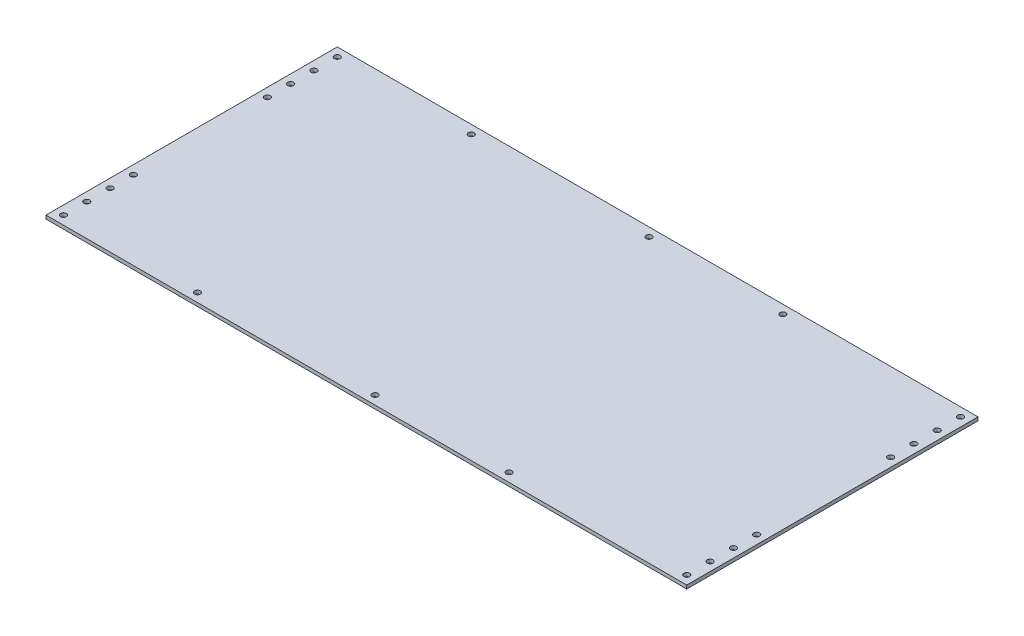
ISO-10303-21;
HEADER;
FILE_DESCRIPTION(('STEP AP214'),'2;1');
FILE_NAME('part.step','',(''),(''),'','','');
FILE_SCHEMA(('AUTOMOTIVE_DESIGN { 1 0 10303 214 1 1 1 1 }'));
ENDSEC;
DATA;
#1=APPLICATION_CONTEXT('core data for automotive mechanical design processes');
#2=APPLICATION_PROTOCOL_DEFINITION('international standard','automotive_design',2000,#1);
#3=PRODUCT_CONTEXT('',#1,'mechanical');
#4=PRODUCT('Part','Part','',(#3));
#5=PRODUCT_RELATED_PRODUCT_CATEGORY('part','',(#4));
#6=PRODUCT_DEFINITION_FORMATION('','',#4);
#7=PRODUCT_DEFINITION_CONTEXT('part definition',#1,'design');
#8=PRODUCT_DEFINITION('design','',#6,#7);
#9=PRODUCT_DEFINITION_SHAPE('','',#8);
#10=(LENGTH_UNIT() NAMED_UNIT(*) SI_UNIT(.MILLI.,.METRE.));
#11=(NAMED_UNIT(*) PLANE_ANGLE_UNIT() SI_UNIT($,.RADIAN.));
#12=(NAMED_UNIT(*) SI_UNIT($,.STERADIAN.) SOLID_ANGLE_UNIT());
#13=UNCERTAINTY_MEASURE_WITH_UNIT(LENGTH_MEASURE(1.E-05),#10,'distance_accuracy_value','');
#14=(GEOMETRIC_REPRESENTATION_CONTEXT(3) GLOBAL_UNCERTAINTY_ASSIGNED_CONTEXT((#13)) GLOBAL_UNIT_ASSIGNED_CONTEXT((#10,
#11,#12)) REPRESENTATION_CONTEXT('',''));
#15=CARTESIAN_POINT('',(0.,0.,0.));
#16=DIRECTION('',(0.,0.,1.));
#17=DIRECTION('',(1.,0.,0.));
#18=AXIS2_PLACEMENT_3D('',#15,#16,#17);
#19=CARTESIAN_POINT('',(-1100.,-12.,499.999999999999));
#20=DIRECTION('',(-1.,0.,0.));
#21=DIRECTION('',(0.,0.,1.));
#22=AXIS2_PLACEMENT_3D('',#19,#20,#21);
#23=PLANE('',#22);
#24=DIRECTION('',(0.,0.,1.));
#25=VECTOR('',#24,1.);
#26=CARTESIAN_POINT('',(-1100.,0.,499.999999999999));
#27=LINE('',#26,#25);
#28=CARTESIAN_POINT('',(-1100.,0.,-499.999999999999));
#29=VERTEX_POINT('',#28);
#30=CARTESIAN_POINT('',(-1100.,0.,499.999999999999));
#31=VERTEX_POINT('',#30);
#32=EDGE_CURVE('E97',#29,#31,#27,.T.);
#33=ORIENTED_EDGE('',*,*,#32,.F.);
#34=DIRECTION('',(0.,1.,0.));
#35=VECTOR('',#34,1.);
#36=CARTESIAN_POINT('',(-1100.,-12.,-499.999999999999));
#37=LINE('',#36,#35);
#38=CARTESIAN_POINT('',(-1100.,-12.,-499.999999999999));
#39=VERTEX_POINT('',#38);
#40=EDGE_CURVE('E11',#39,#29,#37,.T.);
#41=ORIENTED_EDGE('',*,*,#40,.F.);
#42=DIRECTION('',(0.,0.,1.));
#43=VECTOR('',#42,1.);
#44=CARTESIAN_POINT('',(-1100.,-12.,499.999999999999));
#45=LINE('',#44,#43);
#46=CARTESIAN_POINT('',(-1100.,-12.,499.999999999999));
#47=VERTEX_POINT('',#46);
#48=EDGE_CURVE('E90',#39,#47,#45,.T.);
#49=ORIENTED_EDGE('',*,*,#48,.T.);
#50=DIRECTION('',(0.,1.,0.));
#51=VECTOR('',#50,1.);
#52=CARTESIAN_POINT('',(-1100.,-12.,499.999999999999));
#53=LINE('',#52,#51);
#54=EDGE_CURVE('E35',#47,#31,#53,.T.);
#55=ORIENTED_EDGE('',*,*,#54,.T.);
#56=EDGE_LOOP('',(#33,#41,#49,#55));
#57=FACE_BOUND('',#56,.T.);
#58=ADVANCED_FACE('F32',(#57),#23,.T.);
#59=CARTESIAN_POINT('',(-1100.,-12.,-499.999999999999));
#60=DIRECTION('',(0.,0.,-1.));
#61=DIRECTION('',(-1.,0.,0.));
#62=AXIS2_PLACEMENT_3D('',#59,#60,#61);
#63=PLANE('',#62);
#64=DIRECTION('',(-1.,0.,0.));
#65=VECTOR('',#64,1.);
#66=CARTESIAN_POINT('',(-1100.,0.,-499.999999999999));
#67=LINE('',#66,#65);
#68=CARTESIAN_POINT('',(1100.,0.,-499.999999999999));
#69=VERTEX_POINT('',#68);
#70=EDGE_CURVE('E92',#69,#29,#67,.T.);
#71=ORIENTED_EDGE('',*,*,#70,.F.);
#72=DIRECTION('',(0.,1.,0.));
#73=VECTOR('',#72,1.);
#74=CARTESIAN_POINT('',(1100.,-12.,-499.999999999999));
#75=LINE('',#74,#73);
#76=CARTESIAN_POINT('',(1100.,-12.,-499.999999999999));
#77=VERTEX_POINT('',#76);
#78=EDGE_CURVE('E41',#77,#69,#75,.T.);
#79=ORIENTED_EDGE('',*,*,#78,.F.);
#80=DIRECTION('',(-1.,0.,0.));
#81=VECTOR('',#80,1.);
#82=CARTESIAN_POINT('',(-1100.,-12.,-499.999999999999));
#83=LINE('',#82,#81);
#84=EDGE_CURVE('E87',#77,#39,#83,.T.);
#85=ORIENTED_EDGE('',*,*,#84,.T.);
#86=ORIENTED_EDGE('',*,*,#40,.T.);
#87=EDGE_LOOP('',(#71,#79,#85,#86));
#88=FACE_BOUND('',#87,.T.);
#89=ADVANCED_FACE('F108',(#88),#63,.T.);
#90=CARTESIAN_POINT('',(1100.,-12.,500.000000000001));
#91=DIRECTION('',(1.,0.,0.));
#92=DIRECTION('',(0.,0.,-1.));
#93=AXIS2_PLACEMENT_3D('',#90,#91,#92);
#94=PLANE('',#93);
#95=DIRECTION('',(0.,0.,-1.));
#96=VECTOR('',#95,1.);
#97=CARTESIAN_POINT('',(1100.,0.,500.000000000001));
#98=LINE('',#97,#96);
#99=CARTESIAN_POINT('',(1100.,0.,500.000000000001));
#100=VERTEX_POINT('',#99);
#101=EDGE_CURVE('E82',#100,#69,#98,.T.);
#102=ORIENTED_EDGE('',*,*,#101,.F.);
#103=DIRECTION('',(0.,1.,0.));
#104=VECTOR('',#103,1.);
#105=CARTESIAN_POINT('',(1100.,-12.,500.000000000001));
#106=LINE('',#105,#104);
#107=CARTESIAN_POINT('',(1100.,-12.,500.000000000001));
#108=VERTEX_POINT('',#107);
#109=EDGE_CURVE('E77',#108,#100,#106,.T.);
#110=ORIENTED_EDGE('',*,*,#109,.F.);
#111=DIRECTION('',(0.,0.,-1.));
#112=VECTOR('',#111,1.);
#113=CARTESIAN_POINT('',(1100.,-12.,500.000000000001));
#114=LINE('',#113,#112);
#115=EDGE_CURVE('E80',#108,#77,#114,.T.);
#116=ORIENTED_EDGE('',*,*,#115,.T.);
#117=ORIENTED_EDGE('',*,*,#78,.T.);
#118=EDGE_LOOP('',(#102,#110,#116,#117));
#119=FACE_BOUND('',#118,.T.);
#120=ADVANCED_FACE('F79',(#119),#94,.T.);
#121=CARTESIAN_POINT('',(-1100.,-12.,499.999999999999));
#122=DIRECTION('',(0.,0.,1.));
#123=DIRECTION('',(1.,0.,0.));
#124=AXIS2_PLACEMENT_3D('',#121,#122,#123);
#125=PLANE('',#124);
#126=DIRECTION('',(1.,0.,0.));
#127=VECTOR('',#126,1.);
#128=CARTESIAN_POINT('',(-1100.,0.,499.999999999999));
#129=LINE('',#128,#127);
#130=EDGE_CURVE('E100',#31,#100,#129,.T.);
#131=ORIENTED_EDGE('',*,*,#130,.F.);
#132=ORIENTED_EDGE('',*,*,#54,.F.);
#133=DIRECTION('',(1.,0.,0.));
#134=VECTOR('',#133,1.);
#135=CARTESIAN_POINT('',(-1100.,-12.,499.999999999999));
#136=LINE('',#135,#134);
#137=EDGE_CURVE('E86',#47,#108,#136,.T.);
#138=ORIENTED_EDGE('',*,*,#137,.T.);
#139=ORIENTED_EDGE('',*,*,#109,.T.);
#140=EDGE_LOOP('',(#131,#132,#138,#139));
#141=FACE_BOUND('',#140,.T.);
#142=ADVANCED_FACE('F89',(#141),#125,.T.);
#143=CARTESIAN_POINT('',(0.,-12.,0.));
#144=DIRECTION('',(0.,-1.,0.));
#145=DIRECTION('',(0.,0.,-1.));
#146=AXIS2_PLACEMENT_3D('',#143,#144,#145);
#147=PLANE('',#146);
#148=CARTESIAN_POINT('',(-1070.,-12.,230.000000000003));
#149=DIRECTION('',(0.,1.,0.));
#150=DIRECTION('',(0.,0.,-1.));
#151=AXIS2_PLACEMENT_3D('',#148,#149,#150);
#152=CIRCLE('',#151,10.0000000000001);
#153=CARTESIAN_POINT('',(-1070.,-12.,220.000000000003));
#154=VERTEX_POINT('',#153);
#155=EDGE_CURVE('E221',#154,#154,#152,.T.);
#156=ORIENTED_EDGE('',*,*,#155,.T.);
#157=EDGE_LOOP('',(#156));
#158=FACE_BOUND('',#157,.T.);
#159=CARTESIAN_POINT('',(-1070.,-12.,310.000000000002));
#160=DIRECTION('',(0.,1.,0.));
#161=DIRECTION('',(0.,0.,-1.));
#162=AXIS2_PLACEMENT_3D('',#159,#160,#161);
#163=CIRCLE('',#162,9.99999999999988);
#164=CARTESIAN_POINT('',(-1070.,-12.,300.000000000002));
#165=VERTEX_POINT('',#164);
#166=EDGE_CURVE('E229',#165,#165,#163,.T.);
#167=ORIENTED_EDGE('',*,*,#166,.T.);
#168=EDGE_LOOP('',(#167));
#169=FACE_BOUND('',#168,.T.);
#170=CARTESIAN_POINT('',(-1070.,-12.,390.000000000001));
#171=DIRECTION('',(0.,1.,0.));
#172=DIRECTION('',(0.,0.,-1.));
#173=AXIS2_PLACEMENT_3D('',#170,#171,#172);
#174=CIRCLE('',#173,9.99999999999797);
#175=CARTESIAN_POINT('',(-1070.,-12.,380.000000000003));
#176=VERTEX_POINT('',#175);
#177=EDGE_CURVE('E235',#176,#176,#174,.T.);
#178=ORIENTED_EDGE('',*,*,#177,.T.);
#179=EDGE_LOOP('',(#178));
#180=FACE_BOUND('',#179,.T.);
#181=CARTESIAN_POINT('',(-1070.,-12.,470.));
#182=DIRECTION('',(0.,1.,0.));
#183=DIRECTION('',(0.,0.,-1.));
#184=AXIS2_PLACEMENT_3D('',#181,#182,#183);
#185=CIRCLE('',#184,10.0000000000001);
#186=CARTESIAN_POINT('',(-1070.,-12.,460.));
#187=VERTEX_POINT('',#186);
#188=EDGE_CURVE('E241',#187,#187,#185,.T.);
#189=ORIENTED_EDGE('',*,*,#188,.T.);
#190=EDGE_LOOP('',(#189));
#191=FACE_BOUND('',#190,.T.);
#192=CARTESIAN_POINT('',(-609.999999999998,-12.,469.999999999999));
#193=DIRECTION('',(0.,1.,0.));
#194=DIRECTION('',(0.,0.,-1.));
#195=AXIS2_PLACEMENT_3D('',#192,#193,#194);
#196=CIRCLE('',#195,9.99999999999998);
#197=CARTESIAN_POINT('',(-609.999999999998,-12.,459.999999999999));
#198=VERTEX_POINT('',#197);
#199=EDGE_CURVE('E247',#198,#198,#196,.T.);
#200=ORIENTED_EDGE('',*,*,#199,.T.);
#201=EDGE_LOOP('',(#200));
#202=FACE_BOUND('',#201,.T.);
#203=CARTESIAN_POINT('',(1.99840144432528E-12,-12.,469.999999999999));
#204=DIRECTION('',(0.,1.,0.));
#205=DIRECTION('',(0.,0.,-1.));
#206=AXIS2_PLACEMENT_3D('',#203,#204,#205);
#207=CIRCLE('',#206,9.99999999999998);
#208=CARTESIAN_POINT('',(1.99840144432528E-12,-12.,459.999999999999));
#209=VERTEX_POINT('',#208);
#210=EDGE_CURVE('E253',#209,#209,#207,.T.);
#211=ORIENTED_EDGE('',*,*,#210,.T.);
#212=EDGE_LOOP('',(#211));
#213=FACE_BOUND('',#212,.T.);
#214=CARTESIAN_POINT('',(460.000000000002,-12.,469.999999999999));
#215=DIRECTION('',(0.,1.,0.));
#216=DIRECTION('',(0.,0.,-1.));
#217=AXIS2_PLACEMENT_3D('',#214,#215,#216);
#218=CIRCLE('',#217,10.0000000000001);
#219=CARTESIAN_POINT('',(460.000000000002,-12.,459.999999999999));
#220=VERTEX_POINT('',#219);
#221=EDGE_CURVE('E259',#220,#220,#218,.T.);
#222=ORIENTED_EDGE('',*,*,#221,.T.);
#223=EDGE_LOOP('',(#222));
#224=FACE_BOUND('',#223,.T.);
#225=CARTESIAN_POINT('',(1070.,-12.,469.999999999999));
#226=DIRECTION('',(0.,1.,0.));
#227=DIRECTION('',(0.,0.,-1.));
#228=AXIS2_PLACEMENT_3D('',#225,#226,#227);
#229=CIRCLE('',#228,10.0000000000001);
#230=CARTESIAN_POINT('',(1070.,-12.,459.999999999999));
#231=VERTEX_POINT('',#230);
#232=EDGE_CURVE('E265',#231,#231,#229,.T.);
#233=ORIENTED_EDGE('',*,*,#232,.T.);
#234=EDGE_LOOP('',(#233));
#235=FACE_BOUND('',#234,.T.);
#236=CARTESIAN_POINT('',(1070.,-12.,390.));
#237=DIRECTION('',(0.,1.,0.));
#238=DIRECTION('',(0.,0.,-1.));
#239=AXIS2_PLACEMENT_3D('',#236,#237,#238);
#240=CIRCLE('',#239,9.99999999999818);
#241=CARTESIAN_POINT('',(1070.,-12.,380.000000000002));
#242=VERTEX_POINT('',#241);
#243=EDGE_CURVE('E271',#242,#242,#240,.T.);
#244=ORIENTED_EDGE('',*,*,#243,.T.);
#245=EDGE_LOOP('',(#244));
#246=FACE_BOUND('',#245,.T.);
#247=CARTESIAN_POINT('',(1070.,-12.,310.000000000001));
#248=DIRECTION('',(0.,1.,0.));
#249=DIRECTION('',(0.,0.,-1.));
#250=AXIS2_PLACEMENT_3D('',#247,#248,#249);
#251=CIRCLE('',#250,10.0000000000001);
#252=CARTESIAN_POINT('',(1070.,-12.,300.000000000001));
#253=VERTEX_POINT('',#252);
#254=EDGE_CURVE('E277',#253,#253,#251,.T.);
#255=ORIENTED_EDGE('',*,*,#254,.T.);
#256=EDGE_LOOP('',(#255));
#257=FACE_BOUND('',#256,.T.);
#258=CARTESIAN_POINT('',(1070.,-12.,230.000000000002));
#259=DIRECTION('',(0.,1.,0.));
#260=DIRECTION('',(0.,0.,-1.));
#261=AXIS2_PLACEMENT_3D('',#258,#259,#260);
#262=CIRCLE('',#261,10.0000000000001);
#263=CARTESIAN_POINT('',(1070.,-12.,220.000000000002));
#264=VERTEX_POINT('',#263);
#265=EDGE_CURVE('E283',#264,#264,#262,.T.);
#266=ORIENTED_EDGE('',*,*,#265,.T.);
#267=EDGE_LOOP('',(#266));
#268=FACE_BOUND('',#267,.T.);
#269=CARTESIAN_POINT('',(-1070.,-12.,-310.000000000001));
#270=DIRECTION('',(0.,1.,0.));
#271=DIRECTION('',(0.,0.,1.));
#272=AXIS2_PLACEMENT_3D('',#269,#270,#271);
#273=CIRCLE('',#272,9.99999999999988);
#274=CARTESIAN_POINT('',(-1070.,-12.,-300.000000000001));
#275=VERTEX_POINT('',#274);
#276=EDGE_CURVE('E289',#275,#275,#273,.T.);
#277=ORIENTED_EDGE('',*,*,#276,.T.);
#278=EDGE_LOOP('',(#277));
#279=FACE_BOUND('',#278,.T.);
#280=CARTESIAN_POINT('',(-1070.,-12.,-230.000000000002));
#281=DIRECTION('',(0.,1.,0.));
#282=DIRECTION('',(0.,0.,1.));
#283=AXIS2_PLACEMENT_3D('',#280,#281,#282);
#284=CIRCLE('',#283,10.0000000000001);
#285=CARTESIAN_POINT('',(-1070.,-12.,-220.000000000002));
#286=VERTEX_POINT('',#285);
#287=EDGE_CURVE('E295',#286,#286,#284,.T.);
#288=ORIENTED_EDGE('',*,*,#287,.T.);
#289=EDGE_LOOP('',(#288));
#290=FACE_BOUND('',#289,.T.);
#291=CARTESIAN_POINT('',(-1070.,-12.,-390.));
#292=DIRECTION('',(0.,1.,0.));
#293=DIRECTION('',(0.,0.,1.));
#294=AXIS2_PLACEMENT_3D('',#291,#292,#293);
#295=CIRCLE('',#294,9.99999999999797);
#296=CARTESIAN_POINT('',(-1070.,-12.,-380.000000000002));
#297=VERTEX_POINT('',#296);
#298=EDGE_CURVE('E301',#297,#297,#295,.T.);
#299=ORIENTED_EDGE('',*,*,#298,.T.);
#300=EDGE_LOOP('',(#299));
#301=FACE_BOUND('',#300,.T.);
#302=CARTESIAN_POINT('',(-609.999999999998,-12.,-469.999999999999));
#303=DIRECTION('',(0.,1.,0.));
#304=DIRECTION('',(0.,0.,1.));
#305=AXIS2_PLACEMENT_3D('',#302,#303,#304);
#306=CIRCLE('',#305,9.99999999999998);
#307=CARTESIAN_POINT('',(-609.999999999998,-12.,-459.999999999999));
#308=VERTEX_POINT('',#307);
#309=EDGE_CURVE('E307',#308,#308,#306,.T.);
#310=ORIENTED_EDGE('',*,*,#309,.T.);
#311=EDGE_LOOP('',(#310));
#312=FACE_BOUND('',#311,.T.);
#313=CARTESIAN_POINT('',(1.99840144432528E-12,-12.,-469.999999999999));
#314=DIRECTION('',(0.,1.,0.));
#315=DIRECTION('',(0.,0.,1.));
#316=AXIS2_PLACEMENT_3D('',#313,#314,#315);
#317=CIRCLE('',#316,9.99999999999998);
#318=CARTESIAN_POINT('',(1.99840144432528E-12,-12.,-459.999999999999));
#319=VERTEX_POINT('',#318);
#320=EDGE_CURVE('E313',#319,#319,#317,.T.);
#321=ORIENTED_EDGE('',*,*,#320,.T.);
#322=EDGE_LOOP('',(#321));
#323=FACE_BOUND('',#322,.T.);
#324=CARTESIAN_POINT('',(460.000000000002,-12.,-469.999999999999));
#325=DIRECTION('',(0.,1.,0.));
#326=DIRECTION('',(0.,0.,1.));
#327=AXIS2_PLACEMENT_3D('',#324,#325,#326);
#328=CIRCLE('',#327,10.0000000000001);
#329=CARTESIAN_POINT('',(460.000000000002,-12.,-459.999999999999));
#330=VERTEX_POINT('',#329);
#331=EDGE_CURVE('E319',#330,#330,#328,.T.);
#332=ORIENTED_EDGE('',*,*,#331,.T.);
#333=EDGE_LOOP('',(#332));
#334=FACE_BOUND('',#333,.T.);
#335=CARTESIAN_POINT('',(1070.,-12.,-390.));
#336=DIRECTION('',(0.,1.,0.));
#337=DIRECTION('',(0.,0.,1.));
#338=AXIS2_PLACEMENT_3D('',#335,#336,#337);
#339=CIRCLE('',#338,9.99999999999818);
#340=CARTESIAN_POINT('',(1070.,-12.,-380.000000000002));
#341=VERTEX_POINT('',#340);
#342=EDGE_CURVE('E325',#341,#341,#339,.T.);
#343=ORIENTED_EDGE('',*,*,#342,.T.);
#344=EDGE_LOOP('',(#343));
#345=FACE_BOUND('',#344,.T.);
#346=CARTESIAN_POINT('',(1070.,-12.,-310.000000000001));
#347=DIRECTION('',(0.,1.,0.));
#348=DIRECTION('',(0.,0.,1.));
#349=AXIS2_PLACEMENT_3D('',#346,#347,#348);
#350=CIRCLE('',#349,10.0000000000001);
#351=CARTESIAN_POINT('',(1070.,-12.,-300.000000000001));
#352=VERTEX_POINT('',#351);
#353=EDGE_CURVE('E331',#352,#352,#350,.T.);
#354=ORIENTED_EDGE('',*,*,#353,.T.);
#355=EDGE_LOOP('',(#354));
#356=FACE_BOUND('',#355,.T.);
#357=CARTESIAN_POINT('',(1070.,-12.,-230.000000000002));
#358=DIRECTION('',(0.,1.,0.));
#359=DIRECTION('',(0.,0.,1.));
#360=AXIS2_PLACEMENT_3D('',#357,#358,#359);
#361=CIRCLE('',#360,10.0000000000001);
#362=CARTESIAN_POINT('',(1070.,-12.,-220.000000000002));
#363=VERTEX_POINT('',#362);
#364=EDGE_CURVE('E337',#363,#363,#361,.T.);
#365=ORIENTED_EDGE('',*,*,#364,.T.);
#366=EDGE_LOOP('',(#365));
#367=FACE_BOUND('',#366,.T.);
#368=CARTESIAN_POINT('',(1070.,-12.,-469.999999999999));
#369=DIRECTION('',(0.,1.,0.));
#370=DIRECTION('',(0.,0.,1.));
#371=AXIS2_PLACEMENT_3D('',#368,#369,#370);
#372=CIRCLE('',#371,10.0000000000001);
#373=CARTESIAN_POINT('',(1070.,-12.,-459.999999999999));
#374=VERTEX_POINT('',#373);
#375=EDGE_CURVE('E343',#374,#374,#372,.T.);
#376=ORIENTED_EDGE('',*,*,#375,.T.);
#377=EDGE_LOOP('',(#376));
#378=FACE_BOUND('',#377,.T.);
#379=CARTESIAN_POINT('',(-1070.,-12.,-469.999999999999));
#380=DIRECTION('',(0.,1.,0.));
#381=DIRECTION('',(0.,0.,1.));
#382=AXIS2_PLACEMENT_3D('',#379,#380,#381);
#383=CIRCLE('',#382,9.99999999999988);
#384=CARTESIAN_POINT('',(-1070.,-12.,-459.999999999999));
#385=VERTEX_POINT('',#384);
#386=EDGE_CURVE('E101',#385,#385,#383,.T.);
#387=ORIENTED_EDGE('',*,*,#386,.T.);
#388=EDGE_LOOP('',(#387));
#389=FACE_BOUND('',#388,.T.);
#390=ORIENTED_EDGE('',*,*,#48,.F.);
#391=ORIENTED_EDGE('',*,*,#84,.F.);
#392=ORIENTED_EDGE('',*,*,#115,.F.);
#393=ORIENTED_EDGE('',*,*,#137,.F.);
#394=EDGE_LOOP('',(#390,#391,#392,#393));
#395=FACE_BOUND('',#394,.T.);
#396=ADVANCED_FACE('F85',(#158,#169,#180,#191,#202,#213,#224,#235,#246,#257,#268,#279,#290,#301,
#312,#323,#334,#345,#356,#367,#378,#389,#395),#147,.T.);
#397=CARTESIAN_POINT('',(0.,0.,0.));
#398=DIRECTION('',(0.,-1.,0.));
#399=DIRECTION('',(0.,0.,-1.));
#400=AXIS2_PLACEMENT_3D('',#397,#398,#399);
#401=PLANE('',#400);
#402=CARTESIAN_POINT('',(-1070.,0.,230.000000000003));
#403=DIRECTION('',(0.,1.,0.));
#404=DIRECTION('',(0.,0.,-1.));
#405=AXIS2_PLACEMENT_3D('',#402,#403,#404);
#406=CIRCLE('',#405,10.0000000000001);
#407=CARTESIAN_POINT('',(-1070.,0.,220.000000000003));
#408=VERTEX_POINT('',#407);
#409=EDGE_CURVE('E224',#408,#408,#406,.T.);
#410=ORIENTED_EDGE('',*,*,#409,.F.);
#411=EDGE_LOOP('',(#410));
#412=FACE_BOUND('',#411,.T.);
#413=CARTESIAN_POINT('',(-1070.,0.,310.000000000002));
#414=DIRECTION('',(0.,1.,0.));
#415=DIRECTION('',(0.,0.,-1.));
#416=AXIS2_PLACEMENT_3D('',#413,#414,#415);
#417=CIRCLE('',#416,9.99999999999988);
#418=CARTESIAN_POINT('',(-1070.,0.,300.000000000002));
#419=VERTEX_POINT('',#418);
#420=EDGE_CURVE('E226',#419,#419,#417,.T.);
#421=ORIENTED_EDGE('',*,*,#420,.F.);
#422=EDGE_LOOP('',(#421));
#423=FACE_BOUND('',#422,.T.);
#424=CARTESIAN_POINT('',(-1070.,0.,390.000000000001));
#425=DIRECTION('',(0.,1.,0.));
#426=DIRECTION('',(0.,0.,-1.));
#427=AXIS2_PLACEMENT_3D('',#424,#425,#426);
#428=CIRCLE('',#427,9.99999999999797);
#429=CARTESIAN_POINT('',(-1070.,0.,380.000000000003));
#430=VERTEX_POINT('',#429);
#431=EDGE_CURVE('E232',#430,#430,#428,.T.);
#432=ORIENTED_EDGE('',*,*,#431,.F.);
#433=EDGE_LOOP('',(#432));
#434=FACE_BOUND('',#433,.T.);
#435=CARTESIAN_POINT('',(-1070.,0.,470.));
#436=DIRECTION('',(0.,1.,0.));
#437=DIRECTION('',(0.,0.,-1.));
#438=AXIS2_PLACEMENT_3D('',#435,#436,#437);
#439=CIRCLE('',#438,10.0000000000001);
#440=CARTESIAN_POINT('',(-1070.,0.,460.));
#441=VERTEX_POINT('',#440);
#442=EDGE_CURVE('E238',#441,#441,#439,.T.);
#443=ORIENTED_EDGE('',*,*,#442,.F.);
#444=EDGE_LOOP('',(#443));
#445=FACE_BOUND('',#444,.T.);
#446=CARTESIAN_POINT('',(-609.999999999998,0.,469.999999999999));
#447=DIRECTION('',(0.,1.,0.));
#448=DIRECTION('',(0.,0.,-1.));
#449=AXIS2_PLACEMENT_3D('',#446,#447,#448);
#450=CIRCLE('',#449,9.99999999999998);
#451=CARTESIAN_POINT('',(-609.999999999998,0.,459.999999999999));
#452=VERTEX_POINT('',#451);
#453=EDGE_CURVE('E244',#452,#452,#450,.T.);
#454=ORIENTED_EDGE('',*,*,#453,.F.);
#455=EDGE_LOOP('',(#454));
#456=FACE_BOUND('',#455,.T.);
#457=CARTESIAN_POINT('',(1.99840144432528E-12,0.,469.999999999999));
#458=DIRECTION('',(0.,1.,0.));
#459=DIRECTION('',(0.,0.,-1.));
#460=AXIS2_PLACEMENT_3D('',#457,#458,#459);
#461=CIRCLE('',#460,9.99999999999998);
#462=CARTESIAN_POINT('',(1.99840144432528E-12,0.,459.999999999999));
#463=VERTEX_POINT('',#462);
#464=EDGE_CURVE('E250',#463,#463,#461,.T.);
#465=ORIENTED_EDGE('',*,*,#464,.F.);
#466=EDGE_LOOP('',(#465));
#467=FACE_BOUND('',#466,.T.);
#468=CARTESIAN_POINT('',(460.000000000002,0.,469.999999999999));
#469=DIRECTION('',(0.,1.,0.));
#470=DIRECTION('',(0.,0.,-1.));
#471=AXIS2_PLACEMENT_3D('',#468,#469,#470);
#472=CIRCLE('',#471,10.0000000000001);
#473=CARTESIAN_POINT('',(460.000000000002,0.,459.999999999999));
#474=VERTEX_POINT('',#473);
#475=EDGE_CURVE('E256',#474,#474,#472,.T.);
#476=ORIENTED_EDGE('',*,*,#475,.F.);
#477=EDGE_LOOP('',(#476));
#478=FACE_BOUND('',#477,.T.);
#479=CARTESIAN_POINT('',(1070.,0.,469.999999999999));
#480=DIRECTION('',(0.,1.,0.));
#481=DIRECTION('',(0.,0.,-1.));
#482=AXIS2_PLACEMENT_3D('',#479,#480,#481);
#483=CIRCLE('',#482,10.0000000000001);
#484=CARTESIAN_POINT('',(1070.,0.,459.999999999999));
#485=VERTEX_POINT('',#484);
#486=EDGE_CURVE('E262',#485,#485,#483,.T.);
#487=ORIENTED_EDGE('',*,*,#486,.F.);
#488=EDGE_LOOP('',(#487));
#489=FACE_BOUND('',#488,.T.);
#490=CARTESIAN_POINT('',(1070.,0.,390.));
#491=DIRECTION('',(0.,1.,0.));
#492=DIRECTION('',(0.,0.,-1.));
#493=AXIS2_PLACEMENT_3D('',#490,#491,#492);
#494=CIRCLE('',#493,9.99999999999818);
#495=CARTESIAN_POINT('',(1070.,0.,380.000000000002));
#496=VERTEX_POINT('',#495);
#497=EDGE_CURVE('E268',#496,#496,#494,.T.);
#498=ORIENTED_EDGE('',*,*,#497,.F.);
#499=EDGE_LOOP('',(#498));
#500=FACE_BOUND('',#499,.T.);
#501=CARTESIAN_POINT('',(1070.,0.,310.000000000001));
#502=DIRECTION('',(0.,1.,0.));
#503=DIRECTION('',(0.,0.,-1.));
#504=AXIS2_PLACEMENT_3D('',#501,#502,#503);
#505=CIRCLE('',#504,10.0000000000001);
#506=CARTESIAN_POINT('',(1070.,0.,300.000000000001));
#507=VERTEX_POINT('',#506);
#508=EDGE_CURVE('E274',#507,#507,#505,.T.);
#509=ORIENTED_EDGE('',*,*,#508,.F.);
#510=EDGE_LOOP('',(#509));
#511=FACE_BOUND('',#510,.T.);
#512=CARTESIAN_POINT('',(1070.,0.,230.000000000002));
#513=DIRECTION('',(0.,1.,0.));
#514=DIRECTION('',(0.,0.,-1.));
#515=AXIS2_PLACEMENT_3D('',#512,#513,#514);
#516=CIRCLE('',#515,10.0000000000001);
#517=CARTESIAN_POINT('',(1070.,0.,220.000000000002));
#518=VERTEX_POINT('',#517);
#519=EDGE_CURVE('E280',#518,#518,#516,.T.);
#520=ORIENTED_EDGE('',*,*,#519,.F.);
#521=EDGE_LOOP('',(#520));
#522=FACE_BOUND('',#521,.T.);
#523=CARTESIAN_POINT('',(-1070.,0.,-310.000000000001));
#524=DIRECTION('',(0.,1.,0.));
#525=DIRECTION('',(0.,0.,1.));
#526=AXIS2_PLACEMENT_3D('',#523,#524,#525);
#527=CIRCLE('',#526,9.99999999999988);
#528=CARTESIAN_POINT('',(-1070.,0.,-300.000000000001));
#529=VERTEX_POINT('',#528);
#530=EDGE_CURVE('E286',#529,#529,#527,.T.);
#531=ORIENTED_EDGE('',*,*,#530,.F.);
#532=EDGE_LOOP('',(#531));
#533=FACE_BOUND('',#532,.T.);
#534=CARTESIAN_POINT('',(-1070.,0.,-230.000000000002));
#535=DIRECTION('',(0.,1.,0.));
#536=DIRECTION('',(0.,0.,1.));
#537=AXIS2_PLACEMENT_3D('',#534,#535,#536);
#538=CIRCLE('',#537,10.0000000000001);
#539=CARTESIAN_POINT('',(-1070.,0.,-220.000000000002));
#540=VERTEX_POINT('',#539);
#541=EDGE_CURVE('E292',#540,#540,#538,.T.);
#542=ORIENTED_EDGE('',*,*,#541,.F.);
#543=EDGE_LOOP('',(#542));
#544=FACE_BOUND('',#543,.T.);
#545=CARTESIAN_POINT('',(-1070.,0.,-390.));
#546=DIRECTION('',(0.,1.,0.));
#547=DIRECTION('',(0.,0.,1.));
#548=AXIS2_PLACEMENT_3D('',#545,#546,#547);
#549=CIRCLE('',#548,9.99999999999797);
#550=CARTESIAN_POINT('',(-1070.,0.,-380.000000000002));
#551=VERTEX_POINT('',#550);
#552=EDGE_CURVE('E298',#551,#551,#549,.T.);
#553=ORIENTED_EDGE('',*,*,#552,.F.);
#554=EDGE_LOOP('',(#553));
#555=FACE_BOUND('',#554,.T.);
#556=CARTESIAN_POINT('',(-609.999999999998,0.,-469.999999999999));
#557=DIRECTION('',(0.,1.,0.));
#558=DIRECTION('',(0.,0.,1.));
#559=AXIS2_PLACEMENT_3D('',#556,#557,#558);
#560=CIRCLE('',#559,9.99999999999998);
#561=CARTESIAN_POINT('',(-609.999999999998,0.,-459.999999999999));
#562=VERTEX_POINT('',#561);
#563=EDGE_CURVE('E304',#562,#562,#560,.T.);
#564=ORIENTED_EDGE('',*,*,#563,.F.);
#565=EDGE_LOOP('',(#564));
#566=FACE_BOUND('',#565,.T.);
#567=CARTESIAN_POINT('',(1.99840144432528E-12,0.,-469.999999999999));
#568=DIRECTION('',(0.,1.,0.));
#569=DIRECTION('',(0.,0.,1.));
#570=AXIS2_PLACEMENT_3D('',#567,#568,#569);
#571=CIRCLE('',#570,9.99999999999998);
#572=CARTESIAN_POINT('',(1.99840144432528E-12,0.,-459.999999999999));
#573=VERTEX_POINT('',#572);
#574=EDGE_CURVE('E310',#573,#573,#571,.T.);
#575=ORIENTED_EDGE('',*,*,#574,.F.);
#576=EDGE_LOOP('',(#575));
#577=FACE_BOUND('',#576,.T.);
#578=CARTESIAN_POINT('',(460.000000000002,0.,-469.999999999999));
#579=DIRECTION('',(0.,1.,0.));
#580=DIRECTION('',(0.,0.,1.));
#581=AXIS2_PLACEMENT_3D('',#578,#579,#580);
#582=CIRCLE('',#581,10.0000000000001);
#583=CARTESIAN_POINT('',(460.000000000002,0.,-459.999999999999));
#584=VERTEX_POINT('',#583);
#585=EDGE_CURVE('E316',#584,#584,#582,.T.);
#586=ORIENTED_EDGE('',*,*,#585,.F.);
#587=EDGE_LOOP('',(#586));
#588=FACE_BOUND('',#587,.T.);
#589=CARTESIAN_POINT('',(1070.,0.,-390.));
#590=DIRECTION('',(0.,1.,0.));
#591=DIRECTION('',(0.,0.,1.));
#592=AXIS2_PLACEMENT_3D('',#589,#590,#591);
#593=CIRCLE('',#592,9.99999999999818);
#594=CARTESIAN_POINT('',(1070.,0.,-380.000000000002));
#595=VERTEX_POINT('',#594);
#596=EDGE_CURVE('E322',#595,#595,#593,.T.);
#597=ORIENTED_EDGE('',*,*,#596,.F.);
#598=EDGE_LOOP('',(#597));
#599=FACE_BOUND('',#598,.T.);
#600=CARTESIAN_POINT('',(1070.,0.,-310.000000000001));
#601=DIRECTION('',(0.,1.,0.));
#602=DIRECTION('',(0.,0.,1.));
#603=AXIS2_PLACEMENT_3D('',#600,#601,#602);
#604=CIRCLE('',#603,10.0000000000001);
#605=CARTESIAN_POINT('',(1070.,0.,-300.000000000001));
#606=VERTEX_POINT('',#605);
#607=EDGE_CURVE('E328',#606,#606,#604,.T.);
#608=ORIENTED_EDGE('',*,*,#607,.F.);
#609=EDGE_LOOP('',(#608));
#610=FACE_BOUND('',#609,.T.);
#611=CARTESIAN_POINT('',(1070.,0.,-230.000000000002));
#612=DIRECTION('',(0.,1.,0.));
#613=DIRECTION('',(0.,0.,1.));
#614=AXIS2_PLACEMENT_3D('',#611,#612,#613);
#615=CIRCLE('',#614,10.0000000000001);
#616=CARTESIAN_POINT('',(1070.,0.,-220.000000000002));
#617=VERTEX_POINT('',#616);
#618=EDGE_CURVE('E334',#617,#617,#615,.T.);
#619=ORIENTED_EDGE('',*,*,#618,.F.);
#620=EDGE_LOOP('',(#619));
#621=FACE_BOUND('',#620,.T.);
#622=CARTESIAN_POINT('',(1070.,0.,-469.999999999999));
#623=DIRECTION('',(0.,1.,0.));
#624=DIRECTION('',(0.,0.,1.));
#625=AXIS2_PLACEMENT_3D('',#622,#623,#624);
#626=CIRCLE('',#625,10.0000000000001);
#627=CARTESIAN_POINT('',(1070.,0.,-459.999999999999));
#628=VERTEX_POINT('',#627);
#629=EDGE_CURVE('E340',#628,#628,#626,.T.);
#630=ORIENTED_EDGE('',*,*,#629,.F.);
#631=EDGE_LOOP('',(#630));
#632=FACE_BOUND('',#631,.T.);
#633=CARTESIAN_POINT('',(-1070.,0.,-469.999999999999));
#634=DIRECTION('',(0.,1.,0.));
#635=DIRECTION('',(0.,0.,1.));
#636=AXIS2_PLACEMENT_3D('',#633,#634,#635);
#637=CIRCLE('',#636,9.99999999999988);
#638=CARTESIAN_POINT('',(-1070.,0.,-459.999999999999));
#639=VERTEX_POINT('',#638);
#640=EDGE_CURVE('E346',#639,#639,#637,.T.);
#641=ORIENTED_EDGE('',*,*,#640,.F.);
#642=EDGE_LOOP('',(#641));
#643=FACE_BOUND('',#642,.T.);
#644=ORIENTED_EDGE('',*,*,#32,.T.);
#645=ORIENTED_EDGE('',*,*,#130,.T.);
#646=ORIENTED_EDGE('',*,*,#101,.T.);
#647=ORIENTED_EDGE('',*,*,#70,.T.);
#648=EDGE_LOOP('',(#644,#645,#646,#647));
#649=FACE_BOUND('',#648,.T.);
#650=ADVANCED_FACE('F107',(#412,#423,#434,#445,#456,#467,#478,#489,#500,#511,#522,#533,#544,
#555,#566,#577,#588,#599,#610,#621,#632,#643,#649),#401,.F.);
#651=CARTESIAN_POINT('',(-1070.,-12.,-469.999999999999));
#652=DIRECTION('',(0.,1.,0.));
#653=DIRECTION('',(0.,0.,1.));
#654=AXIS2_PLACEMENT_3D('',#651,#652,#653);
#655=CYLINDRICAL_SURFACE('',#654,9.99999999999988);
#656=ORIENTED_EDGE('',*,*,#386,.F.);
#657=EDGE_LOOP('',(#656));
#658=FACE_BOUND('',#657,.T.);
#659=ORIENTED_EDGE('',*,*,#640,.T.);
#660=EDGE_LOOP('',(#659));
#661=FACE_BOUND('',#660,.T.);
#662=ADVANCED_FACE('F126',(#658,#661),#655,.F.);
#663=CARTESIAN_POINT('',(1070.,-12.,-469.999999999999));
#664=DIRECTION('',(0.,1.,0.));
#665=DIRECTION('',(0.,0.,1.));
#666=AXIS2_PLACEMENT_3D('',#663,#664,#665);
#667=CYLINDRICAL_SURFACE('',#666,10.0000000000001);
#668=ORIENTED_EDGE('',*,*,#375,.F.);
#669=EDGE_LOOP('',(#668));
#670=FACE_BOUND('',#669,.T.);
#671=ORIENTED_EDGE('',*,*,#629,.T.);
#672=EDGE_LOOP('',(#671));
#673=FACE_BOUND('',#672,.T.);
#674=ADVANCED_FACE('F133',(#670,#673),#667,.F.);
#675=CARTESIAN_POINT('',(1070.,-12.,-230.000000000002));
#676=DIRECTION('',(0.,1.,0.));
#677=DIRECTION('',(0.,0.,1.));
#678=AXIS2_PLACEMENT_3D('',#675,#676,#677);
#679=CYLINDRICAL_SURFACE('',#678,10.0000000000001);
#680=ORIENTED_EDGE('',*,*,#364,.F.);
#681=EDGE_LOOP('',(#680));
#682=FACE_BOUND('',#681,.T.);
#683=ORIENTED_EDGE('',*,*,#618,.T.);
#684=EDGE_LOOP('',(#683));
#685=FACE_BOUND('',#684,.T.);
#686=ADVANCED_FACE('F137',(#682,#685),#679,.F.);
#687=CARTESIAN_POINT('',(1070.,-12.,-310.000000000001));
#688=DIRECTION('',(0.,1.,0.));
#689=DIRECTION('',(0.,0.,1.));
#690=AXIS2_PLACEMENT_3D('',#687,#688,#689);
#691=CYLINDRICAL_SURFACE('',#690,10.0000000000001);
#692=ORIENTED_EDGE('',*,*,#353,.F.);
#693=EDGE_LOOP('',(#692));
#694=FACE_BOUND('',#693,.T.);
#695=ORIENTED_EDGE('',*,*,#607,.T.);
#696=EDGE_LOOP('',(#695));
#697=FACE_BOUND('',#696,.T.);
#698=ADVANCED_FACE('F141',(#694,#697),#691,.F.);
#699=CARTESIAN_POINT('',(1070.,-12.,-390.));
#700=DIRECTION('',(0.,1.,0.));
#701=DIRECTION('',(0.,0.,1.));
#702=AXIS2_PLACEMENT_3D('',#699,#700,#701);
#703=CYLINDRICAL_SURFACE('',#702,9.99999999999818);
#704=ORIENTED_EDGE('',*,*,#342,.F.);
#705=EDGE_LOOP('',(#704));
#706=FACE_BOUND('',#705,.T.);
#707=ORIENTED_EDGE('',*,*,#596,.T.);
#708=EDGE_LOOP('',(#707));
#709=FACE_BOUND('',#708,.T.);
#710=ADVANCED_FACE('F145',(#706,#709),#703,.F.);
#711=CARTESIAN_POINT('',(460.000000000002,-12.,-469.999999999999));
#712=DIRECTION('',(0.,1.,0.));
#713=DIRECTION('',(0.,0.,1.));
#714=AXIS2_PLACEMENT_3D('',#711,#712,#713);
#715=CYLINDRICAL_SURFACE('',#714,10.0000000000001);
#716=ORIENTED_EDGE('',*,*,#331,.F.);
#717=EDGE_LOOP('',(#716));
#718=FACE_BOUND('',#717,.T.);
#719=ORIENTED_EDGE('',*,*,#585,.T.);
#720=EDGE_LOOP('',(#719));
#721=FACE_BOUND('',#720,.T.);
#722=ADVANCED_FACE('F149',(#718,#721),#715,.F.);
#723=CARTESIAN_POINT('',(1.99840144432528E-12,-12.,-469.999999999999));
#724=DIRECTION('',(0.,1.,0.));
#725=DIRECTION('',(0.,0.,1.));
#726=AXIS2_PLACEMENT_3D('',#723,#724,#725);
#727=CYLINDRICAL_SURFACE('',#726,9.99999999999998);
#728=ORIENTED_EDGE('',*,*,#320,.F.);
#729=EDGE_LOOP('',(#728));
#730=FACE_BOUND('',#729,.T.);
#731=ORIENTED_EDGE('',*,*,#574,.T.);
#732=EDGE_LOOP('',(#731));
#733=FACE_BOUND('',#732,.T.);
#734=ADVANCED_FACE('F153',(#730,#733),#727,.F.);
#735=CARTESIAN_POINT('',(-609.999999999998,-12.,-469.999999999999));
#736=DIRECTION('',(0.,1.,0.));
#737=DIRECTION('',(0.,0.,1.));
#738=AXIS2_PLACEMENT_3D('',#735,#736,#737);
#739=CYLINDRICAL_SURFACE('',#738,9.99999999999998);
#740=ORIENTED_EDGE('',*,*,#309,.F.);
#741=EDGE_LOOP('',(#740));
#742=FACE_BOUND('',#741,.T.);
#743=ORIENTED_EDGE('',*,*,#563,.T.);
#744=EDGE_LOOP('',(#743));
#745=FACE_BOUND('',#744,.T.);
#746=ADVANCED_FACE('F157',(#742,#745),#739,.F.);
#747=CARTESIAN_POINT('',(-1070.,-12.,-390.));
#748=DIRECTION('',(0.,1.,0.));
#749=DIRECTION('',(0.,0.,1.));
#750=AXIS2_PLACEMENT_3D('',#747,#748,#749);
#751=CYLINDRICAL_SURFACE('',#750,9.99999999999797);
#752=ORIENTED_EDGE('',*,*,#298,.F.);
#753=EDGE_LOOP('',(#752));
#754=FACE_BOUND('',#753,.T.);
#755=ORIENTED_EDGE('',*,*,#552,.T.);
#756=EDGE_LOOP('',(#755));
#757=FACE_BOUND('',#756,.T.);
#758=ADVANCED_FACE('F161',(#754,#757),#751,.F.);
#759=CARTESIAN_POINT('',(-1070.,-12.,-230.000000000002));
#760=DIRECTION('',(0.,1.,0.));
#761=DIRECTION('',(0.,0.,1.));
#762=AXIS2_PLACEMENT_3D('',#759,#760,#761);
#763=CYLINDRICAL_SURFACE('',#762,10.0000000000001);
#764=ORIENTED_EDGE('',*,*,#287,.F.);
#765=EDGE_LOOP('',(#764));
#766=FACE_BOUND('',#765,.T.);
#767=ORIENTED_EDGE('',*,*,#541,.T.);
#768=EDGE_LOOP('',(#767));
#769=FACE_BOUND('',#768,.T.);
#770=ADVANCED_FACE('F165',(#766,#769),#763,.F.);
#771=CARTESIAN_POINT('',(-1070.,-12.,-310.000000000001));
#772=DIRECTION('',(0.,1.,0.));
#773=DIRECTION('',(0.,0.,1.));
#774=AXIS2_PLACEMENT_3D('',#771,#772,#773);
#775=CYLINDRICAL_SURFACE('',#774,9.99999999999988);
#776=ORIENTED_EDGE('',*,*,#276,.F.);
#777=EDGE_LOOP('',(#776));
#778=FACE_BOUND('',#777,.T.);
#779=ORIENTED_EDGE('',*,*,#530,.T.);
#780=EDGE_LOOP('',(#779));
#781=FACE_BOUND('',#780,.T.);
#782=ADVANCED_FACE('F169',(#778,#781),#775,.F.);
#783=CARTESIAN_POINT('',(1070.,-12.,230.000000000002));
#784=DIRECTION('',(0.,1.,0.));
#785=DIRECTION('',(0.,0.,1.));
#786=AXIS2_PLACEMENT_3D('',#783,#784,#785);
#787=CYLINDRICAL_SURFACE('',#786,10.0000000000001);
#788=ORIENTED_EDGE('',*,*,#265,.F.);
#789=EDGE_LOOP('',(#788));
#790=FACE_BOUND('',#789,.T.);
#791=ORIENTED_EDGE('',*,*,#519,.T.);
#792=EDGE_LOOP('',(#791));
#793=FACE_BOUND('',#792,.T.);
#794=ADVANCED_FACE('F173',(#790,#793),#787,.F.);
#795=CARTESIAN_POINT('',(1070.,-12.,310.000000000001));
#796=DIRECTION('',(0.,1.,0.));
#797=DIRECTION('',(0.,0.,1.));
#798=AXIS2_PLACEMENT_3D('',#795,#796,#797);
#799=CYLINDRICAL_SURFACE('',#798,10.0000000000001);
#800=ORIENTED_EDGE('',*,*,#254,.F.);
#801=EDGE_LOOP('',(#800));
#802=FACE_BOUND('',#801,.T.);
#803=ORIENTED_EDGE('',*,*,#508,.T.);
#804=EDGE_LOOP('',(#803));
#805=FACE_BOUND('',#804,.T.);
#806=ADVANCED_FACE('F177',(#802,#805),#799,.F.);
#807=CARTESIAN_POINT('',(1070.,-12.,390.));
#808=DIRECTION('',(0.,1.,0.));
#809=DIRECTION('',(0.,0.,1.));
#810=AXIS2_PLACEMENT_3D('',#807,#808,#809);
#811=CYLINDRICAL_SURFACE('',#810,9.99999999999818);
#812=ORIENTED_EDGE('',*,*,#243,.F.);
#813=EDGE_LOOP('',(#812));
#814=FACE_BOUND('',#813,.T.);
#815=ORIENTED_EDGE('',*,*,#497,.T.);
#816=EDGE_LOOP('',(#815));
#817=FACE_BOUND('',#816,.T.);
#818=ADVANCED_FACE('F181',(#814,#817),#811,.F.);
#819=CARTESIAN_POINT('',(1070.,-12.,469.999999999999));
#820=DIRECTION('',(0.,1.,0.));
#821=DIRECTION('',(0.,0.,1.));
#822=AXIS2_PLACEMENT_3D('',#819,#820,#821);
#823=CYLINDRICAL_SURFACE('',#822,10.0000000000001);
#824=ORIENTED_EDGE('',*,*,#232,.F.);
#825=EDGE_LOOP('',(#824));
#826=FACE_BOUND('',#825,.T.);
#827=ORIENTED_EDGE('',*,*,#486,.T.);
#828=EDGE_LOOP('',(#827));
#829=FACE_BOUND('',#828,.T.);
#830=ADVANCED_FACE('F185',(#826,#829),#823,.F.);
#831=CARTESIAN_POINT('',(460.000000000002,-12.,469.999999999999));
#832=DIRECTION('',(0.,1.,0.));
#833=DIRECTION('',(0.,0.,1.));
#834=AXIS2_PLACEMENT_3D('',#831,#832,#833);
#835=CYLINDRICAL_SURFACE('',#834,10.0000000000001);
#836=ORIENTED_EDGE('',*,*,#221,.F.);
#837=EDGE_LOOP('',(#836));
#838=FACE_BOUND('',#837,.T.);
#839=ORIENTED_EDGE('',*,*,#475,.T.);
#840=EDGE_LOOP('',(#839));
#841=FACE_BOUND('',#840,.T.);
#842=ADVANCED_FACE('F189',(#838,#841),#835,.F.);
#843=CARTESIAN_POINT('',(1.99840144432528E-12,-12.,469.999999999999));
#844=DIRECTION('',(0.,1.,0.));
#845=DIRECTION('',(0.,0.,1.));
#846=AXIS2_PLACEMENT_3D('',#843,#844,#845);
#847=CYLINDRICAL_SURFACE('',#846,9.99999999999998);
#848=ORIENTED_EDGE('',*,*,#210,.F.);
#849=EDGE_LOOP('',(#848));
#850=FACE_BOUND('',#849,.T.);
#851=ORIENTED_EDGE('',*,*,#464,.T.);
#852=EDGE_LOOP('',(#851));
#853=FACE_BOUND('',#852,.T.);
#854=ADVANCED_FACE('F193',(#850,#853),#847,.F.);
#855=CARTESIAN_POINT('',(-609.999999999998,-12.,469.999999999999));
#856=DIRECTION('',(0.,1.,0.));
#857=DIRECTION('',(0.,0.,1.));
#858=AXIS2_PLACEMENT_3D('',#855,#856,#857);
#859=CYLINDRICAL_SURFACE('',#858,9.99999999999998);
#860=ORIENTED_EDGE('',*,*,#199,.F.);
#861=EDGE_LOOP('',(#860));
#862=FACE_BOUND('',#861,.T.);
#863=ORIENTED_EDGE('',*,*,#453,.T.);
#864=EDGE_LOOP('',(#863));
#865=FACE_BOUND('',#864,.T.);
#866=ADVANCED_FACE('F197',(#862,#865),#859,.F.);
#867=CARTESIAN_POINT('',(-1070.,-12.,470.));
#868=DIRECTION('',(0.,1.,0.));
#869=DIRECTION('',(0.,0.,1.));
#870=AXIS2_PLACEMENT_3D('',#867,#868,#869);
#871=CYLINDRICAL_SURFACE('',#870,10.0000000000001);
#872=ORIENTED_EDGE('',*,*,#188,.F.);
#873=EDGE_LOOP('',(#872));
#874=FACE_BOUND('',#873,.T.);
#875=ORIENTED_EDGE('',*,*,#442,.T.);
#876=EDGE_LOOP('',(#875));
#877=FACE_BOUND('',#876,.T.);
#878=ADVANCED_FACE('F201',(#874,#877),#871,.F.);
#879=CARTESIAN_POINT('',(-1070.,-12.,390.000000000001));
#880=DIRECTION('',(0.,1.,0.));
#881=DIRECTION('',(0.,0.,1.));
#882=AXIS2_PLACEMENT_3D('',#879,#880,#881);
#883=CYLINDRICAL_SURFACE('',#882,9.99999999999797);
#884=ORIENTED_EDGE('',*,*,#177,.F.);
#885=EDGE_LOOP('',(#884));
#886=FACE_BOUND('',#885,.T.);
#887=ORIENTED_EDGE('',*,*,#431,.T.);
#888=EDGE_LOOP('',(#887));
#889=FACE_BOUND('',#888,.T.);
#890=ADVANCED_FACE('F205',(#886,#889),#883,.F.);
#891=CARTESIAN_POINT('',(-1070.,-12.,310.000000000002));
#892=DIRECTION('',(0.,1.,0.));
#893=DIRECTION('',(0.,0.,1.));
#894=AXIS2_PLACEMENT_3D('',#891,#892,#893);
#895=CYLINDRICAL_SURFACE('',#894,9.99999999999988);
#896=ORIENTED_EDGE('',*,*,#166,.F.);
#897=EDGE_LOOP('',(#896));
#898=FACE_BOUND('',#897,.T.);
#899=ORIENTED_EDGE('',*,*,#420,.T.);
#900=EDGE_LOOP('',(#899));
#901=FACE_BOUND('',#900,.T.);
#902=ADVANCED_FACE('F209',(#898,#901),#895,.F.);
#903=CARTESIAN_POINT('',(-1070.,-12.,230.000000000003));
#904=DIRECTION('',(0.,1.,0.));
#905=DIRECTION('',(0.,0.,1.));
#906=AXIS2_PLACEMENT_3D('',#903,#904,#905);
#907=CYLINDRICAL_SURFACE('',#906,10.0000000000001);
#908=ORIENTED_EDGE('',*,*,#155,.F.);
#909=EDGE_LOOP('',(#908));
#910=FACE_BOUND('',#909,.T.);
#911=ORIENTED_EDGE('',*,*,#409,.T.);
#912=EDGE_LOOP('',(#911));
#913=FACE_BOUND('',#912,.T.);
#914=ADVANCED_FACE('F213',(#910,#913),#907,.F.);
#915=CLOSED_SHELL('',(#58,#89,#120,#142,#396,#650,#662,#674,#686,#698,#710,#722,#734,#746,#758,
#770,#782,#794,#806,#818,#830,#842,#854,#866,#878,#890,#902,#914));
#916=MANIFOLD_SOLID_BREP('B2',#915);
#917=ADVANCED_BREP_SHAPE_REPRESENTATION('',(#18,#916),#14);
#918=SHAPE_DEFINITION_REPRESENTATION(#9,#917);
ENDSEC;
END-ISO-10303-21;
